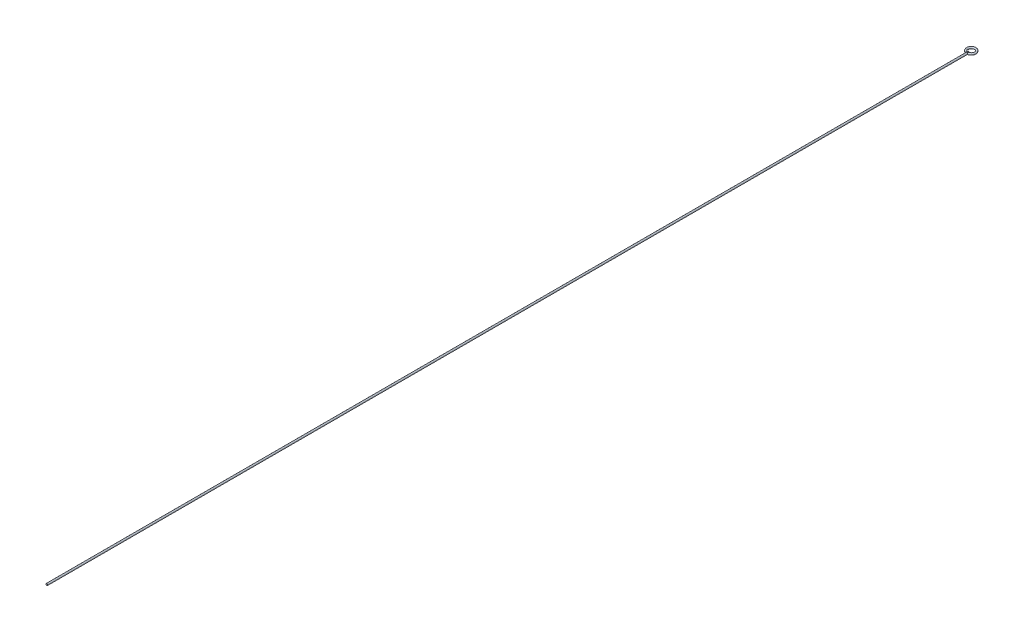
ISO-10303-21;
HEADER;
FILE_DESCRIPTION(('STEP AP214'),'2;1');
FILE_NAME('part.step','',(''),(''),'','','');
FILE_SCHEMA(('AUTOMOTIVE_DESIGN { 1 0 10303 214 1 1 1 1 }'));
ENDSEC;
DATA;
#1=APPLICATION_CONTEXT('core data for automotive mechanical design processes');
#2=APPLICATION_PROTOCOL_DEFINITION('international standard','automotive_design',2000,#1);
#3=PRODUCT_CONTEXT('',#1,'mechanical');
#4=PRODUCT('Part','Part','',(#3));
#5=PRODUCT_RELATED_PRODUCT_CATEGORY('part','',(#4));
#6=PRODUCT_DEFINITION_FORMATION('','',#4);
#7=PRODUCT_DEFINITION_CONTEXT('part definition',#1,'design');
#8=PRODUCT_DEFINITION('design','',#6,#7);
#9=PRODUCT_DEFINITION_SHAPE('','',#8);
#10=(LENGTH_UNIT() NAMED_UNIT(*) SI_UNIT(.MILLI.,.METRE.));
#11=(NAMED_UNIT(*) PLANE_ANGLE_UNIT() SI_UNIT($,.RADIAN.));
#12=(NAMED_UNIT(*) SI_UNIT($,.STERADIAN.) SOLID_ANGLE_UNIT());
#13=UNCERTAINTY_MEASURE_WITH_UNIT(LENGTH_MEASURE(1.E-05),#10,'distance_accuracy_value','');
#14=(GEOMETRIC_REPRESENTATION_CONTEXT(3) GLOBAL_UNCERTAINTY_ASSIGNED_CONTEXT((#13)) GLOBAL_UNIT_ASSIGNED_CONTEXT((#10,
#11,#12)) REPRESENTATION_CONTEXT('',''));
#15=CARTESIAN_POINT('',(0.,0.,0.));
#16=DIRECTION('',(0.,0.,1.));
#17=DIRECTION('',(1.,0.,0.));
#18=AXIS2_PLACEMENT_3D('',#15,#16,#17);
#19=CARTESIAN_POINT('',(0.,0.,2131.));
#20=DIRECTION('',(0.,0.,-1.));
#21=DIRECTION('',(-1.,0.,0.));
#22=AXIS2_PLACEMENT_3D('',#19,#20,#21);
#23=CYLINDRICAL_SURFACE('',#22,2.);
#24=CARTESIAN_POINT('',(0.,0.,6.));
#25=DIRECTION('',(0.,0.,1.));
#26=DIRECTION('',(1.,0.,0.));
#27=AXIS2_PLACEMENT_3D('',#24,#25,#26);
#28=CIRCLE('',#27,2.);
#29=CARTESIAN_POINT('',(2.,0.,6.));
#30=VERTEX_POINT('',#29);
#31=EDGE_CURVE('E143',#30,#30,#28,.T.);
#32=ORIENTED_EDGE('',*,*,#31,.T.);
#33=EDGE_LOOP('',(#32));
#34=FACE_BOUND('',#33,.T.);
#35=CARTESIAN_POINT('',(0.,0.,8.99999999999995));
#36=DIRECTION('',(0.,-0.707106781186547,-0.707106781186547));
#37=DIRECTION('',(0.,0.707106781186547,-0.707106781186547));
#38=AXIS2_PLACEMENT_3D('',#35,#36,#37);
#39=ELLIPSE('',#38,2.82842712474619,2.);
#40=CARTESIAN_POINT('',(1.35264002569453,1.47321585685503,7.52678414314496));
#41=VERTEX_POINT('',#40);
#42=CARTESIAN_POINT('',(-1.35264002569453,1.47321585685503,7.52678414314496));
#43=VERTEX_POINT('',#42);
#44=EDGE_CURVE('E69',#41,#43,#39,.F.);
#45=ORIENTED_EDGE('',*,*,#44,.F.);
#46=CARTESIAN_POINT('',(0.,2.,9.));
#47=CARTESIAN_POINT('',(0.00210812272485549,1.99999999524163,8.99789188802901));
#48=CARTESIAN_POINT('',(0.00421593956644162,1.99999666225178,8.99578333024149));
#49=CARTESIAN_POINT('',(0.167613924135622,1.99948039837144,8.83226960574343));
#50=CARTESIAN_POINT('',(0.327073545426945,1.97949150565761,8.66829200657743));
#51=CARTESIAN_POINT('',(0.559345306955797,1.92185890331424,8.42250655543371));
#52=CARTESIAN_POINT('',(0.635774550072601,1.89795770338682,8.34043033607726));
#53=CARTESIAN_POINT('',(0.785828632202429,1.84089832490799,8.17690254413226));
#54=CARTESIAN_POINT('',(0.859454740640768,1.80774439459674,8.09545070246308));
#55=CARTESIAN_POINT('',(0.986802312314143,1.74073148220367,7.95244891859763));
#56=CARTESIAN_POINT('',(1.04121847231176,1.70877538708495,7.89061593086873));
#57=CARTESIAN_POINT('',(1.14772281824378,1.63913978914488,7.7681871378529));
#58=CARTESIAN_POINT('',(1.19981153935845,1.60146161093816,7.70759104990733));
#59=CARTESIAN_POINT('',(1.30118823189935,1.5202366704838,7.58829101877278));
#60=CARTESIAN_POINT('',(1.35048232911553,1.47670351006603,7.52958306965177));
#61=CARTESIAN_POINT('',(1.44590645589761,1.3834030904459,7.41464671127423));
#62=CARTESIAN_POINT('',(1.49203807201466,1.3336389931221,7.35841706383646));
#63=CARTESIAN_POINT('',(1.59107508834011,1.21482851937822,7.23637955182586));
#64=CARTESIAN_POINT('',(1.64298967668924,1.14400888206332,7.17146570606956));
#65=CARTESIAN_POINT('',(1.73936977351839,0.991323551090359,7.04947167026083));
#66=CARTESIAN_POINT('',(1.78384415074728,0.909471221739623,6.99238216846505));
#67=CARTESIAN_POINT('',(1.85334026653697,0.755288037111378,6.9022751968222));
#68=CARTESIAN_POINT('',(1.88046912857674,0.685383347646647,6.86676841761969));
#69=CARTESIAN_POINT('',(1.92743179933544,0.539316860970757,6.80493837359133));
#70=CARTESIAN_POINT('',(1.94727704682289,0.463165106806872,6.77860071222888));
#71=CARTESIAN_POINT('',(1.97556961285693,0.318783066173252,6.74092329606359));
#72=CARTESIAN_POINT('',(1.98534423195506,0.251273624055717,6.7278429328771));
#73=CARTESIAN_POINT('',(1.99790013385232,0.114464445911381,6.7110261722765));
#74=CARTESIAN_POINT('',(2.00068618016804,0.0451659618898008,6.70728341022207));
#75=CARTESIAN_POINT('',(1.99902507748093,-0.0932269459276112,6.70951183766348));
#76=CARTESIAN_POINT('',(1.99457331702574,-0.162321211505731,6.71548922019384));
#77=CARTESIAN_POINT('',(1.97881704351064,-0.298296919509378,6.73657185136085));
#78=CARTESIAN_POINT('',(1.96750720820041,-0.365176600738755,6.75168418920589));
#79=CARTESIAN_POINT('',(1.93506816593579,-0.512441459084677,6.79480275118913));
#80=CARTESIAN_POINT('',(1.91213546025074,-0.591734040697845,6.82515897002035));
#81=CARTESIAN_POINT('',(1.85856088034207,-0.743125211635407,6.89544348555838));
#82=CARTESIAN_POINT('',(1.82790417359937,-0.815209582570209,6.93539019199368));
#83=CARTESIAN_POINT('',(1.74457274468806,-0.984436833153287,7.04285113385104));
#84=CARTESIAN_POINT('',(1.6883570290898,-1.07721453123317,7.11444602840009));
#85=CARTESIAN_POINT('',(1.56655663215454,-1.24776658358752,7.26689981805269));
#86=CARTESIAN_POINT('',(1.50095088388114,-1.32550625145298,7.34777946086476));
#87=CARTESIAN_POINT('',(1.37952593702835,-1.45000149540649,7.49483605281066));
#88=CARTESIAN_POINT('',(1.32520348461172,-1.49969547185001,7.55980886574149));
#89=CARTESIAN_POINT('',(1.21314827324628,-1.5917071804358,7.69205451956285));
#90=CARTESIAN_POINT('',(1.15541377381436,-1.63402110376991,7.75932852679196));
#91=CARTESIAN_POINT('',(1.03704301514678,-1.71159292484037,7.89543290864361));
#92=CARTESIAN_POINT('',(0.976405158426919,-1.74684688145539,7.96426412882959));
#93=CARTESIAN_POINT('',(0.852660755306097,-1.81047203631426,8.10289576687222));
#94=CARTESIAN_POINT('',(0.78955348783574,-1.83884120651604,8.17269646392042));
#95=CARTESIAN_POINT('',(0.610804546614742,-1.90841633093616,8.36786297402596));
#96=CARTESIAN_POINT('',(0.492836854291632,-1.942200198497,8.49380520408929));
#97=CARTESIAN_POINT('',(0.252404421297302,-1.98776362380408,8.74485234646825));
#98=CARTESIAN_POINT('',(0.129951986381222,-1.99959937761332,8.86995857770249));
#99=CARTESIAN_POINT('',(0.00421596897733761,-1.99999666242279,8.99578329472263));
#100=CARTESIAN_POINT('',(0.00210815236588643,-1.99999999546546,8.99789185220298));
#101=CARTESIAN_POINT('',(0.,-2.,9.));
#102=B_SPLINE_CURVE_WITH_KNOTS('',3,(#46,#47,#48,#49,#50,#51,#52,#53,#54,#55,#56,#57,#58,#59,
#60,#61,#62,#63,#64,#65,#66,#67,#68,#69,#70,#71,#72,#73,#74,#75,#76,#77,#78,#79,#80,#81,#82,#83,
#84,#85,#86,#87,#88,#89,#90,#91,#92,#93,#94,#95,#96,#97,#98,#99,#100,#101),.UNSPECIFIED.,.F.,
.F.,(4,2,2,2,2,2,2,2,2,2,2,2,2,2,2,2,2,2,2,2,2,2,2,2,2,2,2,4),(0.,0.00894427763439276,
0.693463340548152,1.03721792390917,1.38081493688326,1.64566760393445,1.91045905299039,
2.17464565570114,2.43869873659253,2.765420344639,3.09174968111581,3.33979698238755,
3.58745304642157,3.7949062300617,4.00221797201264,4.20966185108035,4.41726692462344,
4.67964926094177,4.94253934644232,5.33032605505973,5.71899682912705,6.01320435682701,
6.30756327711401,6.60208606362033,6.8966955022802,7.42273283312614,7.94742142567657,
7.95636570331097),.UNSPECIFIED.);
#103=CARTESIAN_POINT('',(0.,-2.,9.));
#104=VERTEX_POINT('',#103);
#105=EDGE_CURVE('E87',#41,#104,#102,.T.);
#106=ORIENTED_EDGE('',*,*,#105,.T.);
#107=CARTESIAN_POINT('',(0.,-2.,9.));
#108=CARTESIAN_POINT('',(-0.00210812281673464,-1.99999999522043,8.99789188791853));
#109=CARTESIAN_POINT('',(-0.00421593965739362,-1.99999666223077,8.99578333013208));
#110=CARTESIAN_POINT('',(-0.167560181324545,-1.99948056975998,8.8323233880122));
#111=CARTESIAN_POINT('',(-0.32696675195338,-1.97950494761941,8.66840191870725));
#112=CARTESIAN_POINT('',(-0.559216059382703,-1.92189753031176,8.42264488964913));
#113=CARTESIAN_POINT('',(-0.63567067494967,-1.89799351522413,8.34054262259513));
#114=CARTESIAN_POINT('',(-0.785775657620221,-1.84092214721491,8.17696118579845));
#115=CARTESIAN_POINT('',(-0.85942716648386,-1.80775861277157,8.09548177340016));
#116=CARTESIAN_POINT('',(-0.9920433812676,-1.73797377007946,7.94656350032068));
#117=CARTESIAN_POINT('',(-1.05150167163175,-1.70270752073526,7.87892428965972));
#118=CARTESIAN_POINT('',(-1.16759156470104,-1.62529867063073,7.74518027672068));
#119=CARTESIAN_POINT('',(-1.22422391693607,-1.58315790600938,7.67907507009051));
#120=CARTESIAN_POINT('',(-1.33400361220664,-1.49181720763244,7.54931319009775));
#121=CARTESIAN_POINT('',(-1.38716151471322,-1.44264026506811,7.48564936654748));
#122=CARTESIAN_POINT('',(-1.48950133830031,-1.33671412704701,7.36157721996779));
#123=CARTESIAN_POINT('',(-1.53868650148317,-1.27997120842671,7.30116625602252));
#124=CARTESIAN_POINT('',(-1.63590185236871,-1.15355006440853,7.18036815228713));
#125=CARTESIAN_POINT('',(-1.6835409610825,-1.08320730338549,7.12035228256487));
#126=CARTESIAN_POINT('',(-1.77153892677512,-0.932338035959171,7.00824014783504));
#127=CARTESIAN_POINT('',(-1.81190780169888,-0.851825806987339,6.95613300090427));
#128=CARTESIAN_POINT('',(-1.87496019578697,-0.699769267514736,6.87400995593979));
#129=CARTESIAN_POINT('',(-1.89957878737217,-0.630307364371497,6.8416626964872));
#130=CARTESIAN_POINT('',(-1.94158368263275,-0.485699315960796,6.78618200054536));
#131=CARTESIAN_POINT('',(-1.95897695801999,-0.410558733207491,6.76303968312301));
#132=CARTESIAN_POINT('',(-1.98521163434984,-0.255306637811716,6.72803925667524));
#133=CARTESIAN_POINT('',(-1.99396192801052,-0.175151445237371,6.71630138469673));
#134=CARTESIAN_POINT('',(-2.0015846199076,-0.0135488722900314,6.70608008295928));
#135=CARTESIAN_POINT('',(-2.00046509167047,0.0678973975459251,6.70758581990957));
#136=CARTESIAN_POINT('',(-1.98944469125792,0.21629550290041,6.72235289941695));
#137=CARTESIAN_POINT('',(-1.98092098145687,0.283549889390735,6.73377046536731));
#138=CARTESIAN_POINT('',(-1.9576135231973,0.4149813990234,6.76485012458238));
#139=CARTESIAN_POINT('',(-1.94282623610741,0.479156759807489,6.78451687819511));
#140=CARTESIAN_POINT('',(-1.90100607177353,0.62791180686494,6.83980377475538));
#141=CARTESIAN_POINT('',(-1.87144395301354,0.710568557822906,6.87865656362555));
#142=CARTESIAN_POINT('',(-1.8042867883329,0.867089095996453,6.96597031107501));
#143=CARTESIAN_POINT('',(-1.76667353305592,0.94093234988721,7.01445303157465));
#144=CARTESIAN_POINT('',(-1.69516895751138,1.06307112096457,7.1055265444169));
#145=CARTESIAN_POINT('',(-1.66258173877175,1.11322320659098,7.14670138154396));
#146=CARTESIAN_POINT('',(-1.59444312510289,1.20879941091162,7.23200179048099));
#147=CARTESIAN_POINT('',(-1.55889023135597,1.25422111253153,7.27612885205345));
#148=CARTESIAN_POINT('',(-1.44836058319067,1.38390360382743,7.41199469228825));
#149=CARTESIAN_POINT('',(-1.36959019508658,1.46145491791321,7.50711893013921));
#150=CARTESIAN_POINT('',(-1.22702739334483,1.58131390002394,7.67584622558699));
#151=CARTESIAN_POINT('',(-1.1649715539871,1.62747453778939,7.74828398318769));
#152=CARTESIAN_POINT('',(-1.0374568327385,1.71158359329953,7.89500780835266));
#153=CARTESIAN_POINT('',(-0.97199625749404,1.74952787523423,7.96929478586714));
#154=CARTESIAN_POINT('',(-0.838300428260966,1.81737917623812,8.11887848848734));
#155=CARTESIAN_POINT('',(-0.770067593052083,1.84729303549615,8.19417429651397));
#156=CARTESIAN_POINT('',(-0.631214355133998,1.89922653631293,8.34528911285155));
#157=CARTESIAN_POINT('',(-0.560593827584704,1.92124576440157,8.42110814835391));
#158=CARTESIAN_POINT('',(-0.410456441955563,1.95910382152955,8.58013428661545));
#159=CARTESIAN_POINT('',(-0.33074062401078,1.97413702807548,8.66334538900742));
#160=CARTESIAN_POINT('',(-0.1696324996886,1.99444291521224,8.82912635111679));
#161=CARTESIAN_POINT('',(-0.0882430568500704,1.99973105887858,8.91169701933976));
#162=CARTESIAN_POINT('',(-0.00421597799849515,1.99999666510451,8.99578328341028));
#163=CARTESIAN_POINT('',(-0.00210816129678702,1.99999999825347,8.99789184094395));
#164=CARTESIAN_POINT('',(0.,2.,9.));
#165=B_SPLINE_CURVE_WITH_KNOTS('',3,(#107,#108,#109,#110,#111,#112,#113,#114,#115,#116,#117,
#118,#119,#120,#121,#122,#123,#124,#125,#126,#127,#128,#129,#130,#131,#132,#133,#134,#135,#136,
#137,#138,#139,#140,#141,#142,#143,#144,#145,#146,#147,#148,#149,#150,#151,#152,#153,#154,#155,
#156,#157,#158,#159,#160,#161,#162,#163,#164),.UNSPECIFIED.,.F.,.F.,(4,2,2,2,2,2,2,2,2,2,2,2,2,
2,2,2,2,2,2,2,2,2,2,2,2,2,2,2,4),(0.,0.00894427763439247,0.693235284872066,1.03709620770501,
1.38081553668151,1.67070137815846,1.96050991937383,2.2493922465932,2.53803638718291,
2.84925187412126,3.16003518783422,3.40061645321139,3.64096503933566,3.88382097631995,
4.12647827529289,4.3318119603711,4.53726180452924,4.82365829646621,5.11070951146949,
5.32825416948067,5.54590944600044,5.98174983211696,6.29931050487529,6.61703065626395,
6.93447931365045,7.2519445945319,7.60017195305405,7.94784628099176,7.95679055862615),.UNSPECIFIED.);
#166=EDGE_CURVE('E57',#104,#43,#165,.T.);
#167=ORIENTED_EDGE('',*,*,#166,.T.);
#168=EDGE_LOOP('',(#45,#106,#167));
#169=FACE_BOUND('',#168,.T.);
#170=ADVANCED_FACE('F50',(#34,#169),#23,.T.);
#171=CARTESIAN_POINT('',(0.,0.,0.));
#172=DIRECTION('',(0.,1.,0.));
#173=DIRECTION('',(0.,0.,1.));
#174=AXIS2_PLACEMENT_3D('',#171,#172,#173);
#175=TOROIDAL_SURFACE('',#174,9.,2.);
#176=CARTESIAN_POINT('',(0.,-2.,9.));
#177=CARTESIAN_POINT('',(-0.00210813566360726,-1.99999999621851,9.00210814033236));
#178=CARTESIAN_POINT('',(-0.00421669348929261,-1.99999666316268,9.00421595728533));
#179=CARTESIAN_POINT('',(-0.12548305339383,-1.99961332650367,9.12539691573438));
#180=CARTESIAN_POINT('',(-0.245964359588998,-1.98859475135822,9.24341809029718));
#181=CARTESIAN_POINT('',(-0.487109149983447,-1.94365693286957,9.47530639674726));
#182=CARTESIAN_POINT('',(-0.607772571942503,-1.90969652209743,9.58916567258907));
#183=CARTESIAN_POINT('',(-0.834074541954399,-1.82142087642756,9.79914559797621));
#184=CARTESIAN_POINT('',(-0.940019055922948,-1.76945017202415,9.89590704603683));
#185=CARTESIAN_POINT('',(-1.14583570608838,-1.64364373365732,10.0813493120836));
#186=CARTESIAN_POINT('',(-1.24571685416162,-1.56984145663594,10.170042225139));
#187=CARTESIAN_POINT('',(-1.4136189137677,-1.41825875657198,10.3174275833848));
#188=CARTESIAN_POINT('',(-1.48376905953368,-1.3450605100989,10.3783930320642));
#189=CARTESIAN_POINT('',(-1.61471790048577,-1.18463880690381,10.4913345793827));
#190=CARTESIAN_POINT('',(-1.67552761245912,-1.09743212513255,10.5433212773641));
#191=CARTESIAN_POINT('',(-1.77478428716533,-0.926353710318032,10.6276798861735));
#192=CARTESIAN_POINT('',(-1.81528312788267,-0.84458727760655,10.6618932176933));
#193=CARTESIAN_POINT('',(-1.88550324495746,-0.673365369382744,10.7210043740859));
#194=CARTESIAN_POINT('',(-1.9152296699809,-0.583913592431083,10.7459066493507));
#195=CARTESIAN_POINT('',(-1.96214448660349,-0.398924072215992,10.7851283867986));
#196=CARTESIAN_POINT('',(-1.97925899264492,-0.303353974877754,10.7993854917399));
#197=CARTESIAN_POINT('',(-1.99935443664308,-0.109726153581529,10.8161201338528));
#198=CARTESIAN_POINT('',(-2.00234163694619,-0.01166955122383,10.8186028903542));
#199=CARTESIAN_POINT('',(-1.99439135361487,0.173587411449419,10.8119863102));
#200=CARTESIAN_POINT('',(-1.98481672561042,0.260892659605481,10.8040205709291));
#201=CARTESIAN_POINT('',(-1.95468015907166,0.432190521398464,10.7788867370267));
#202=CARTESIAN_POINT('',(-1.93411849795593,0.516183218618588,10.7617188747453));
#203=CARTESIAN_POINT('',(-1.88288386691657,0.679849447135278,10.7187858931498));
#204=CARTESIAN_POINT('',(-1.85209142640975,0.75945833048192,10.6929191463783));
#205=CARTESIAN_POINT('',(-1.78201198567968,0.911856242748462,10.6337712400145));
#206=CARTESIAN_POINT('',(-1.74272089255953,0.984641961381502,10.6004865077324));
#207=CARTESIAN_POINT('',(-1.64073809578724,1.14917511418757,10.5136014862792));
#208=CARTESIAN_POINT('',(-1.57486133376123,1.23743276935939,10.4571135343963));
#209=CARTESIAN_POINT('',(-1.43364590451805,1.39864089505199,10.3348623366671));
#210=CARTESIAN_POINT('',(-1.35828953628894,1.47156202918398,10.2690817098407));
#211=CARTESIAN_POINT('',(-1.17672911837757,1.62273840358883,10.1088750766247));
#212=CARTESIAN_POINT('',(-1.06823938784045,1.69555124601216,10.0119175958925));
#213=CARTESIAN_POINT('',(-0.845624349368952,1.81687322449657,9.80976484388612));
#214=CARTESIAN_POINT('',(-0.731493260565011,1.86535683770973,9.70456105490035));
#215=CARTESIAN_POINT('',(-0.514979017282203,1.93550014935202,9.50150988048361));
#216=CARTESIAN_POINT('',(-0.412808723642618,1.95965999756638,9.40427073941701));
#217=CARTESIAN_POINT('',(-0.208890587943532,1.99173089977155,9.20704773317217));
#218=CARTESIAN_POINT('',(-0.107142316156886,1.99967122691566,9.10706914339473));
#219=CARTESIAN_POINT('',(-0.00421670053831873,1.9999966647455,9.00421596331506));
#220=CARTESIAN_POINT('',(-0.00210814271059113,1.9999999978573,9.00210814634574));
#221=CARTESIAN_POINT('',(0.,2.,9.));
#222=B_SPLINE_CURVE_WITH_KNOTS('',3,(#176,#177,#178,#179,#180,#181,#182,#183,#184,#185,#186,
#187,#188,#189,#190,#191,#192,#193,#194,#195,#196,#197,#198,#199,#200,#201,#202,#203,#204,#205,
#206,#207,#208,#209,#210,#211,#212,#213,#214,#215,#216,#217,#218,#219,#220,#221),.UNSPECIFIED.,
.F.,.F.,(4,2,2,2,2,2,2,2,2,2,2,2,2,2,2,2,2,2,2,2,2,2,4),(0.,0.00894427764205546,
0.514297822774271,1.0205606047617,1.47676775267206,1.93227935231262,2.28590440078253,
2.63910910129282,2.93026688790138,3.22128533180887,3.51399540911486,3.80657572184656,
4.06989231205833,4.33320225393652,4.59970192125942,4.86633022002375,5.23562030895417,
5.60561049390473,6.09111315566196,6.57712408012804,7.005468666335,7.4330394864561,
7.44198376409816),.UNSPECIFIED.);
#223=CARTESIAN_POINT('',(-1.46478627664232,1.36176398974283,10.3617639897636));
#224=VERTEX_POINT('',#223);
#225=EDGE_CURVE('E83',#224,#104,#222,.F.);
#226=ORIENTED_EDGE('',*,*,#225,.F.);
#227=CARTESIAN_POINT('',(-0.278984328329074,0.252555034282111,10.9804463498279));
#228=CARTESIAN_POINT('',(-0.341032299275194,0.308816785711044,10.971697312331));
#229=CARTESIAN_POINT('',(-0.402787175520897,0.364904444712523,10.9600313604992));
#230=CARTESIAN_POINT('',(-0.525405712639506,0.476579760990675,10.930785774125));
#231=CARTESIAN_POINT('',(-0.586268843536572,0.532167113918051,10.9132027608011));
#232=CARTESIAN_POINT('',(-0.767694114446806,0.698530893909304,10.8512261129245));
#233=CARTESIAN_POINT('',(-0.886323086517937,0.808214805253446,10.797709873668));
#234=CARTESIAN_POINT('',(-1.10449743191817,1.01271340929389,10.6716938216711));
#235=CARTESIAN_POINT('',(-1.20480471291837,1.1079902921113,10.6012588714503));
#236=CARTESIAN_POINT('',(-1.39417858581926,1.29132333733151,10.4393473254541));
#237=CARTESIAN_POINT('',(-1.48327356267481,1.37939752741099,10.3479255891005));
#238=CARTESIAN_POINT('',(-1.62635756425338,1.52501793389885,10.1682545141693));
#239=CARTESIAN_POINT('',(-1.68364716228215,1.58482859193742,10.0844720782639));
#240=CARTESIAN_POINT('',(-1.78657695772627,1.69594632219661,9.90488576402343));
#241=CARTESIAN_POINT('',(-1.83223017729539,1.74726287732439,9.8090955042804));
#242=CARTESIAN_POINT('',(-1.90110327409864,1.82917694209918,9.62711331274587));
#243=CARTESIAN_POINT('',(-1.9269902975717,1.86186577547437,9.54287986653186));
#244=CARTESIAN_POINT('',(-1.96772932464872,1.91803808059917,9.36879939928997));
#245=CARTESIAN_POINT('',(-1.98258736073887,1.94152658129644,9.27895547620386));
#246=CARTESIAN_POINT('',(-1.99988550650642,1.97751775227634,9.09509029651349));
#247=CARTESIAN_POINT('',(-2.00222547074295,1.98993116631186,9.00104140349721));
#248=CARTESIAN_POINT('',(-1.99343855447658,2.00184136461934,8.81276236079122));
#249=CARTESIAN_POINT('',(-1.98232357275786,2.00134955358552,8.71853244472223));
#250=CARTESIAN_POINT('',(-1.94945124558754,1.98787383671371,8.545742041081));
#251=CARTESIAN_POINT('',(-1.92927472739967,1.97653104786835,8.46674323998275));
#252=CARTESIAN_POINT('',(-1.8802445945597,1.9441425260652,8.31360003088698));
#253=CARTESIAN_POINT('',(-1.85139024102706,1.92309596679151,8.23945603691038));
#254=CARTESIAN_POINT('',(-1.78647810372815,1.87228462849486,8.09744024527687));
#255=CARTESIAN_POINT('',(-1.75040456498548,1.8425007138606,8.02958264921749));
#256=CARTESIAN_POINT('',(-1.67273510562387,1.775591134665,7.901090213176));
#257=CARTESIAN_POINT('',(-1.63113712065219,1.73846272309056,7.84045808932736));
#258=CARTESIAN_POINT('',(-1.51966530693271,1.63595602016267,7.69498754403719));
#259=CARTESIAN_POINT('',(-1.4468988727737,1.56632630725528,7.61536016202647));
#260=CARTESIAN_POINT('',(-1.29554727273083,1.41689166603998,7.4727694003756));
#261=CARTESIAN_POINT('',(-1.21694506020552,1.33705639383153,7.4098575114432));
#262=CARTESIAN_POINT('',(-1.07647731662475,1.19121159753111,7.31282586876721));
#263=CARTESIAN_POINT('',(-1.01528633060277,1.12667292415188,7.27543401999356));
#264=CARTESIAN_POINT('',(-0.891732713458826,0.994686038754979,7.20842059482677));
#265=CARTESIAN_POINT('',(-0.829369415231154,0.927236139956455,7.17880359555519));
#266=CARTESIAN_POINT('',(-0.703957264882275,0.790267081339172,7.12675337578009));
#267=CARTESIAN_POINT('',(-0.640908411073402,0.720747916425671,7.10432017296539));
#268=CARTESIAN_POINT('',(-0.514428022286602,0.580297397907398,7.06616318299553));
#269=CARTESIAN_POINT('',(-0.450996645568032,0.509366603673868,7.05043679150805));
#270=CARTESIAN_POINT('',(-0.323965494201565,0.366657387279736,7.02535199039301));
#271=CARTESIAN_POINT('',(-0.260365898896941,0.294879702930309,7.01598840209356));
#272=CARTESIAN_POINT('',(-0.133144091242998,0.150965904072657,7.00341492179225));
#273=CARTESIAN_POINT('',(-0.0695220246822158,0.0788304023982243,7.00019676003563));
#274=CARTESIAN_POINT('',(-0.00394403870693451,0.00447211926849953,7.00000292094687));
#275=CARTESIAN_POINT('',(-0.00197201055846326,0.00223604965939209,7.00000000461182));
#276=CARTESIAN_POINT('',(0.,0.,6.99999999999994));
#277=B_SPLINE_CURVE_WITH_KNOTS('',3,(#227,#228,#229,#230,#231,#232,#233,#234,#235,#236,#237,
#238,#239,#240,#241,#242,#243,#244,#245,#246,#247,#248,#249,#250,#251,#252,#253,#254,#255,#256,
#257,#258,#259,#260,#261,#262,#263,#264,#265,#266,#267,#268,#269,#270,#271,#272,#273,#274,#275,
#276),.UNSPECIFIED.,.F.,.F.,(4,2,2,2,2,2,2,2,2,2,2,2,2,2,2,2,2,2,2,2,2,2,2,2,4),(0.,
0.252525007273027,0.505194457653169,1.01362887360167,1.47768174343743,1.94053512102782,
2.29273223056546,2.64453345203281,2.925407340084,3.20612748610629,3.48909009077905,
3.77180264222164,4.01756468907104,4.26334766743381,4.50967300376842,4.75609064631938,
5.13909450396268,5.52326484315896,5.81231843331428,6.1015418121403,6.39076590312239,
6.67987758256171,6.96875367187785,7.25724075279862,7.26618502898769),.UNSPECIFIED.);
#278=EDGE_CURVE('E64',#224,#43,#277,.T.);
#279=ORIENTED_EDGE('',*,*,#278,.T.);
#280=ORIENTED_EDGE('',*,*,#166,.F.);
#281=EDGE_LOOP('',(#226,#279,#280));
#282=FACE_BOUND('',#281,.T.);
#283=ORIENTED_EDGE('',*,*,#105,.F.);
#284=CARTESIAN_POINT('',(0.,0.,6.99999999999994));
#285=CARTESIAN_POINT('',(0.00197200558539978,0.00223604415623799,7.00000000726764));
#286=CARTESIAN_POINT('',(0.00394403367869625,0.00447211383449829,7.00000292351707));
#287=CARTESIAN_POINT('',(0.086309510355738,0.0978655855921385,7.00024627615483));
#288=CARTESIAN_POINT('',(0.166736821605377,0.18905342113691,7.00532037436683));
#289=CARTESIAN_POINT('',(0.327444795800098,0.370596847578183,7.02532394244063));
#290=CARTESIAN_POINT('',(0.407725259679,0.460951608979088,7.04026234333921));
#291=CARTESIAN_POINT('',(0.567879896610451,0.639882864434265,7.08053740597835));
#292=CARTESIAN_POINT('',(0.647753628116782,0.728457646675771,7.1058836179045));
#293=CARTESIAN_POINT('',(0.806444403308602,0.902453230817283,7.16781686480063));
#294=CARTESIAN_POINT('',(0.885262439152536,0.987877149100629,7.20439244012978));
#295=CARTESIAN_POINT('',(1.04564486296813,1.15898062137926,7.29251965623021));
#296=CARTESIAN_POINT('',(1.12710034671618,1.24438304255954,7.34482194644957));
#297=CARTESIAN_POINT('',(1.28610504507349,1.40733023796999,7.46512479010024));
#298=CARTESIAN_POINT('',(1.36366150778746,1.48488988537231,7.53309479608316));
#299=CARTESIAN_POINT('',(1.49756871468223,1.61469797300902,7.67158913901954));
#300=CARTESIAN_POINT('',(1.55511522853616,1.66893816948891,7.7390623418424));
#301=CARTESIAN_POINT('',(1.66336950177998,1.76752948086768,7.88578374284636));
#302=CARTESIAN_POINT('',(1.71408570020292,1.81189284396914,7.9650171516315));
#303=CARTESIAN_POINT('',(1.79711596910519,1.88090689029902,8.11879309318628));
#304=CARTESIAN_POINT('',(1.83109831493492,1.90768893584303,8.19147006163587));
#305=CARTESIAN_POINT('',(1.89073428464265,1.95152621952012,8.34293718373426));
#306=CARTESIAN_POINT('',(1.91639339079346,1.96858786581904,8.42172327093353));
#307=CARTESIAN_POINT('',(1.95797599907966,1.99218097146844,8.58366027549327));
#308=CARTESIAN_POINT('',(1.97386558511434,1.99867587404283,8.66682532257792));
#309=CARTESIAN_POINT('',(1.9949467082737,2.00095739395134,8.83464786754227));
#310=CARTESIAN_POINT('',(2.00013648924427,1.99674225370444,8.91930560811777));
#311=CARTESIAN_POINT('',(1.99986498537268,1.97882488569162,9.08311828828159));
#312=CARTESIAN_POINT('',(1.9949386956797,1.96562264796312,9.16233201549185));
#313=CARTESIAN_POINT('',(1.97612867546671,1.93133293095876,9.3179011947627));
#314=CARTESIAN_POINT('',(1.96224320746574,1.91024392251082,9.39425608936153));
#315=CARTESIAN_POINT('',(1.92464215418107,1.85892642359147,9.55029763452883));
#316=CARTESIAN_POINT('',(1.90007625681985,1.82799058866414,9.62954341632031));
#317=CARTESIAN_POINT('',(1.8426167995583,1.75958201275042,9.78192698871827));
#318=CARTESIAN_POINT('',(1.80971758433926,1.72210483794423,9.85506058634919));
#319=CARTESIAN_POINT('',(1.71797400907648,1.62109322518337,10.030955991012));
#320=CARTESIAN_POINT('',(1.65452970899772,1.55413594148303,10.1293739473849));
#321=CARTESIAN_POINT('',(1.51540431846422,1.41176376183523,10.3101994714906));
#322=CARTESIAN_POINT('',(1.43969568884161,1.33632995169079,10.3925700664963));
#323=CARTESIAN_POINT('',(1.25606989383751,1.156982448241,10.5627369340911));
#324=CARTESIAN_POINT('',(1.14515978525165,1.05112797501227,10.6452506308595));
#325=CARTESIAN_POINT('',(0.913514852246209,0.833467275133547,10.7843060091386));
#326=CARTESIAN_POINT('',(0.79277725312767,0.721659370691553,10.8408403254659));
#327=CARTESIAN_POINT('',(0.605282623299159,0.549552452227408,10.9074164692394));
#328=CARTESIAN_POINT('',(0.540583762792071,0.490425763600587,10.9267299827533));
#329=CARTESIAN_POINT('',(0.410356584806322,0.371779468878348,10.9585901567271));
#330=CARTESIAN_POINT('',(0.34483237874118,0.312262225747122,10.9711623786155));
#331=CARTESIAN_POINT('',(0.278984328328222,0.252555034283174,10.9804463498283));
#332=B_SPLINE_CURVE_WITH_KNOTS('',3,(#284,#285,#286,#287,#288,#289,#290,#291,#292,#293,#294,
#295,#296,#297,#298,#299,#300,#301,#302,#303,#304,#305,#306,#307,#308,#309,#310,#311,#312,#313,
#314,#315,#316,#317,#318,#319,#320,#321,#322,#323,#324,#325,#326,#327,#328,#329,#330,#331),
.UNSPECIFIED.,.F.,.F.,(4,2,2,2,2,2,2,2,2,2,2,2,2,2,2,2,2,2,2,2,2,2,2,4),(0.,0.00894427618999834,
0.373570720432245,0.738527747131717,1.10382040864581,1.46874151872556,1.85500097537943,
2.24051361568764,2.55127046490325,2.86163977286961,3.11431912299534,3.36683170111989,
3.62021602994925,3.87364194332273,4.11401066402534,4.3544260141886,4.61909306662194,
4.88394021605999,5.28636627144298,5.68970881726486,6.20933895931852,6.729116326351,
6.99813996458008,7.26613618122504),.UNSPECIFIED.);
#333=CARTESIAN_POINT('',(1.46478627664232,1.36176398974283,10.3617639897636));
#334=VERTEX_POINT('',#333);
#335=EDGE_CURVE('E93',#41,#334,#332,.T.);
#336=ORIENTED_EDGE('',*,*,#335,.T.);
#337=CARTESIAN_POINT('',(0.,-2.,9.));
#338=CARTESIAN_POINT('',(0.00210813566360726,-1.99999999621851,9.00210814033236));
#339=CARTESIAN_POINT('',(0.00421669348929261,-1.99999666316268,9.00421595728533));
#340=CARTESIAN_POINT('',(0.12548305339383,-1.99961332650367,9.12539691573438));
#341=CARTESIAN_POINT('',(0.245964359588998,-1.98859475135822,9.24341809029718));
#342=CARTESIAN_POINT('',(0.487109149983447,-1.94365693286957,9.47530639674726));
#343=CARTESIAN_POINT('',(0.607772571942503,-1.90969652209743,9.58916567258907));
#344=CARTESIAN_POINT('',(0.834074541954399,-1.82142087642756,9.79914559797621));
#345=CARTESIAN_POINT('',(0.940019055922948,-1.76945017202415,9.89590704603683));
#346=CARTESIAN_POINT('',(1.14583570608838,-1.64364373365732,10.0813493120836));
#347=CARTESIAN_POINT('',(1.24571685416162,-1.56984145663594,10.170042225139));
#348=CARTESIAN_POINT('',(1.4136189137677,-1.41825875657198,10.3174275833848));
#349=CARTESIAN_POINT('',(1.48376905953368,-1.3450605100989,10.3783930320642));
#350=CARTESIAN_POINT('',(1.61471790048577,-1.18463880690381,10.4913345793827));
#351=CARTESIAN_POINT('',(1.67552761245912,-1.09743212513255,10.5433212773641));
#352=CARTESIAN_POINT('',(1.77478428716533,-0.926353710318032,10.6276798861735));
#353=CARTESIAN_POINT('',(1.81528312788267,-0.84458727760655,10.6618932176933));
#354=CARTESIAN_POINT('',(1.88550324495746,-0.673365369382744,10.7210043740859));
#355=CARTESIAN_POINT('',(1.9152296699809,-0.583913592431083,10.7459066493507));
#356=CARTESIAN_POINT('',(1.96214448660349,-0.398924072215992,10.7851283867986));
#357=CARTESIAN_POINT('',(1.97925899264492,-0.303353974877754,10.7993854917399));
#358=CARTESIAN_POINT('',(1.99935443664308,-0.109726153581529,10.8161201338528));
#359=CARTESIAN_POINT('',(2.00234163694619,-0.01166955122383,10.8186028903542));
#360=CARTESIAN_POINT('',(1.99439135361487,0.173587411449419,10.8119863102));
#361=CARTESIAN_POINT('',(1.98481672561042,0.260892659605481,10.8040205709291));
#362=CARTESIAN_POINT('',(1.95468015907166,0.432190521398464,10.7788867370267));
#363=CARTESIAN_POINT('',(1.93411849795593,0.516183218618588,10.7617188747453));
#364=CARTESIAN_POINT('',(1.88288386691657,0.679849447135278,10.7187858931498));
#365=CARTESIAN_POINT('',(1.85209142640975,0.75945833048192,10.6929191463783));
#366=CARTESIAN_POINT('',(1.78201198567968,0.911856242748462,10.6337712400145));
#367=CARTESIAN_POINT('',(1.74272089255953,0.984641961381502,10.6004865077324));
#368=CARTESIAN_POINT('',(1.64073809578724,1.14917511418757,10.5136014862792));
#369=CARTESIAN_POINT('',(1.57486133376123,1.23743276935939,10.4571135343963));
#370=CARTESIAN_POINT('',(1.43364590451805,1.39864089505199,10.3348623366671));
#371=CARTESIAN_POINT('',(1.35828953628894,1.47156202918398,10.2690817098407));
#372=CARTESIAN_POINT('',(1.17672911837757,1.62273840358883,10.1088750766247));
#373=CARTESIAN_POINT('',(1.06823938784045,1.69555124601216,10.0119175958925));
#374=CARTESIAN_POINT('',(0.845624349368952,1.81687322449657,9.80976484388612));
#375=CARTESIAN_POINT('',(0.731493260565011,1.86535683770973,9.70456105490035));
#376=CARTESIAN_POINT('',(0.514979017282203,1.93550014935202,9.50150988048361));
#377=CARTESIAN_POINT('',(0.412808723642618,1.95965999756638,9.40427073941701));
#378=CARTESIAN_POINT('',(0.208890587943532,1.99173089977155,9.20704773317217));
#379=CARTESIAN_POINT('',(0.107142316156886,1.99967122691566,9.10706914339473));
#380=CARTESIAN_POINT('',(0.00421670053831873,1.9999966647455,9.00421596331506));
#381=CARTESIAN_POINT('',(0.00210814271059113,1.9999999978573,9.00210814634574));
#382=CARTESIAN_POINT('',(0.,2.,9.));
#383=B_SPLINE_CURVE_WITH_KNOTS('',3,(#337,#338,#339,#340,#341,#342,#343,#344,#345,#346,#347,
#348,#349,#350,#351,#352,#353,#354,#355,#356,#357,#358,#359,#360,#361,#362,#363,#364,#365,#366,
#367,#368,#369,#370,#371,#372,#373,#374,#375,#376,#377,#378,#379,#380,#381,#382),.UNSPECIFIED.,
.F.,.F.,(4,2,2,2,2,2,2,2,2,2,2,2,2,2,2,2,2,2,2,2,2,2,4),(0.,0.00894427764205546,
0.514297822774271,1.0205606047617,1.47676775267206,1.93227935231262,2.28590440078253,
2.63910910129282,2.93026688790138,3.22128533180887,3.51399540911486,3.80657572184656,
4.06989231205833,4.33320225393652,4.59970192125942,4.86633022002375,5.23562030895417,
5.60561049390473,6.09111315566196,6.57712408012804,7.005468666335,7.4330394864561,
7.44198376409816),.UNSPECIFIED.);
#384=EDGE_CURVE('E85',#104,#334,#383,.T.);
#385=ORIENTED_EDGE('',*,*,#384,.F.);
#386=EDGE_LOOP('',(#283,#336,#385));
#387=FACE_BOUND('',#386,.T.);
#388=ADVANCED_FACE('F95',(#282,#387),#175,.T.);
#389=CARTESIAN_POINT('',(0.,0.,2131.));
#390=DIRECTION('',(0.,0.,1.));
#391=DIRECTION('',(1.,0.,0.));
#392=AXIS2_PLACEMENT_3D('',#389,#390,#391);
#393=CIRCLE('',#392,2.);
#394=CARTESIAN_POINT('',(2.,0.,2131.));
#395=VERTEX_POINT('',#394);
#396=EDGE_CURVE('E145',#395,#395,#393,.T.);
#397=ORIENTED_EDGE('',*,*,#396,.F.);
#398=EDGE_LOOP('',(#397));
#399=FACE_BOUND('',#398,.T.);
#400=CARTESIAN_POINT('',(0.,0.,8.99999999999995));
#401=DIRECTION('',(0.,0.707106781186547,-0.707106781186547));
#402=DIRECTION('',(0.,-0.707106781186547,-0.707106781186547));
#403=AXIS2_PLACEMENT_3D('',#400,#401,#402);
#404=ELLIPSE('',#403,2.82842712474619,2.);
#405=EDGE_CURVE('E11',#224,#334,#404,.T.);
#406=ORIENTED_EDGE('',*,*,#405,.F.);
#407=ORIENTED_EDGE('',*,*,#225,.T.);
#408=ORIENTED_EDGE('',*,*,#384,.T.);
#409=EDGE_LOOP('',(#406,#407,#408));
#410=FACE_BOUND('',#409,.T.);
#411=ADVANCED_FACE('F81',(#399,#410),#23,.T.);
#412=CARTESIAN_POINT('',(0.,0.,6.));
#413=DIRECTION('',(0.,0.,1.));
#414=DIRECTION('',(1.,0.,0.));
#415=AXIS2_PLACEMENT_3D('',#412,#413,#414);
#416=PLANE('',#415);
#417=ORIENTED_EDGE('',*,*,#31,.F.);
#418=EDGE_LOOP('',(#417));
#419=FACE_BOUND('',#418,.T.);
#420=ADVANCED_FACE('F134',(#419),#416,.F.);
#421=CARTESIAN_POINT('',(0.,0.,2131.));
#422=DIRECTION('',(0.,0.,1.));
#423=DIRECTION('',(1.,0.,0.));
#424=AXIS2_PLACEMENT_3D('',#421,#422,#423);
#425=PLANE('',#424);
#426=ORIENTED_EDGE('',*,*,#396,.T.);
#427=EDGE_LOOP('',(#426));
#428=FACE_BOUND('',#427,.T.);
#429=ADVANCED_FACE('F119',(#428),#425,.T.);
#430=CARTESIAN_POINT('',(0.,2.1,9.));
#431=DIRECTION('',(0.,-1.,0.));
#432=DIRECTION('',(0.,0.,-1.));
#433=AXIS2_PLACEMENT_3D('',#430,#431,#432);
#434=CYLINDRICAL_SURFACE('',#433,2.);
#435=CARTESIAN_POINT('',(0.,2.1,9.));
#436=DIRECTION('',(0.,1.,0.));
#437=DIRECTION('',(0.,0.,1.));
#438=AXIS2_PLACEMENT_3D('',#435,#436,#437);
#439=CIRCLE('',#438,2.);
#440=CARTESIAN_POINT('',(0.,2.1,11.));
#441=VERTEX_POINT('',#440);
#442=EDGE_CURVE('E96',#441,#441,#439,.T.);
#443=ORIENTED_EDGE('',*,*,#442,.F.);
#444=EDGE_LOOP('',(#443));
#445=FACE_BOUND('',#444,.T.);
#446=ORIENTED_EDGE('',*,*,#335,.F.);
#447=ORIENTED_EDGE('',*,*,#44,.T.);
#448=ORIENTED_EDGE('',*,*,#278,.F.);
#449=ORIENTED_EDGE('',*,*,#405,.T.);
#450=EDGE_LOOP('',(#446,#447,#448,#449));
#451=FACE_BOUND('',#450,.T.);
#452=ADVANCED_FACE('F98',(#445,#451),#434,.T.);
#453=CARTESIAN_POINT('',(0.,2.1,9.));
#454=DIRECTION('',(0.,1.,0.));
#455=DIRECTION('',(0.,0.,1.));
#456=AXIS2_PLACEMENT_3D('',#453,#454,#455);
#457=PLANE('',#456);
#458=ORIENTED_EDGE('',*,*,#442,.T.);
#459=EDGE_LOOP('',(#458));
#460=FACE_BOUND('',#459,.T.);
#461=ADVANCED_FACE('F118',(#460),#457,.T.);
#462=CLOSED_SHELL('',(#170,#388,#411,#420,#429,#452,#461));
#463=MANIFOLD_SOLID_BREP('B2',#462);
#464=ADVANCED_BREP_SHAPE_REPRESENTATION('',(#18,#463),#14);
#465=SHAPE_DEFINITION_REPRESENTATION(#9,#464);
ENDSEC;
END-ISO-10303-21;
